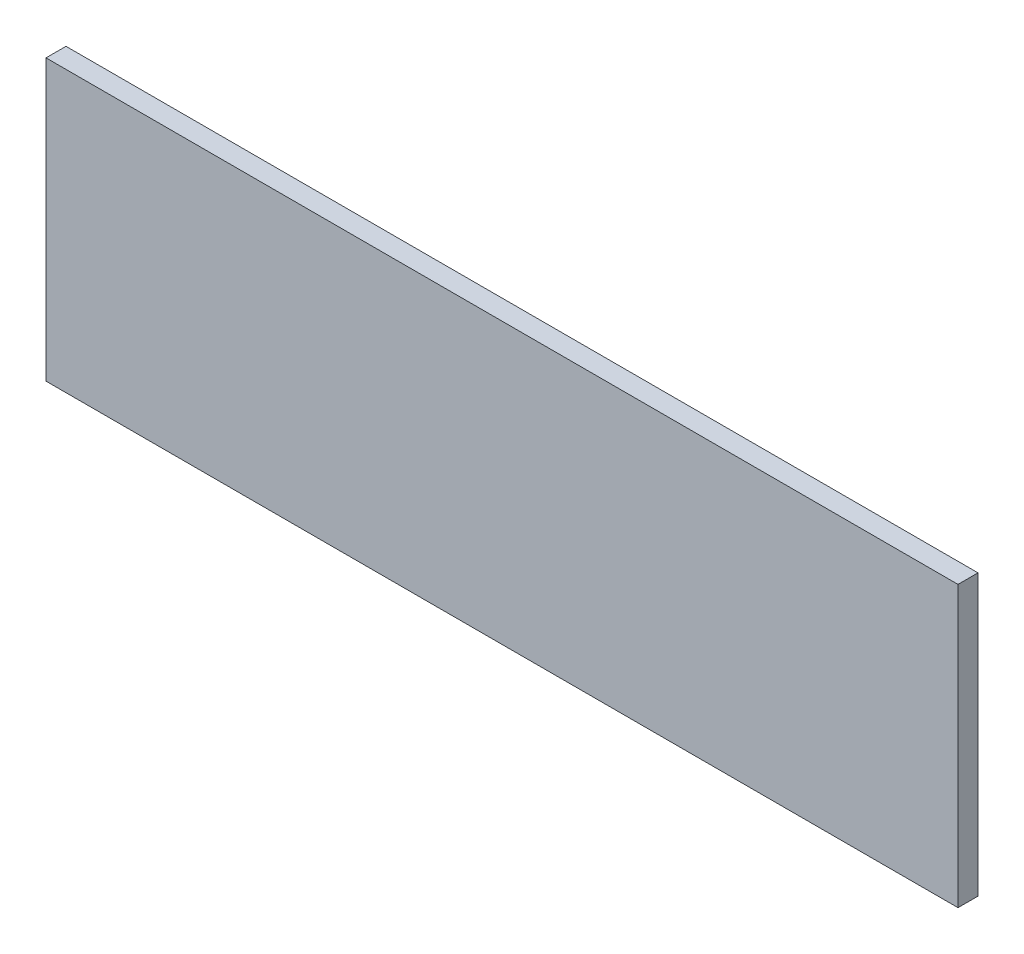
ISO-10303-21;
HEADER;
FILE_DESCRIPTION(('STEP AP214'),'2;1');
FILE_NAME('part.step','',(''),(''),'','','');
FILE_SCHEMA(('AUTOMOTIVE_DESIGN { 1 0 10303 214 1 1 1 1 }'));
ENDSEC;
DATA;
#1=APPLICATION_CONTEXT('core data for automotive mechanical design processes');
#2=APPLICATION_PROTOCOL_DEFINITION('international standard','automotive_design',2000,#1);
#3=PRODUCT_CONTEXT('',#1,'mechanical');
#4=PRODUCT('Part','Part','',(#3));
#5=PRODUCT_RELATED_PRODUCT_CATEGORY('part','',(#4));
#6=PRODUCT_DEFINITION_FORMATION('','',#4);
#7=PRODUCT_DEFINITION_CONTEXT('part definition',#1,'design');
#8=PRODUCT_DEFINITION('design','',#6,#7);
#9=PRODUCT_DEFINITION_SHAPE('','',#8);
#10=(LENGTH_UNIT() NAMED_UNIT(*) SI_UNIT(.MILLI.,.METRE.));
#11=(NAMED_UNIT(*) PLANE_ANGLE_UNIT() SI_UNIT($,.RADIAN.));
#12=(NAMED_UNIT(*) SI_UNIT($,.STERADIAN.) SOLID_ANGLE_UNIT());
#13=UNCERTAINTY_MEASURE_WITH_UNIT(LENGTH_MEASURE(1.E-05),#10,'distance_accuracy_value','');
#14=(GEOMETRIC_REPRESENTATION_CONTEXT(3) GLOBAL_UNCERTAINTY_ASSIGNED_CONTEXT((#13)) GLOBAL_UNIT_ASSIGNED_CONTEXT((#10,
#11,#12)) REPRESENTATION_CONTEXT('',''));
#15=CARTESIAN_POINT('',(0.,0.,0.));
#16=DIRECTION('',(0.,0.,1.));
#17=DIRECTION('',(1.,0.,0.));
#18=AXIS2_PLACEMENT_3D('',#15,#16,#17);
#19=CARTESIAN_POINT('',(-114.,-35.,5.));
#20=DIRECTION('',(1.,0.,0.));
#21=DIRECTION('',(0.,0.,-1.));
#22=AXIS2_PLACEMENT_3D('',#19,#20,#21);
#23=PLANE('',#22);
#24=DIRECTION('',(0.,-1.,0.));
#25=VECTOR('',#24,1.);
#26=CARTESIAN_POINT('',(-114.,-35.,0.));
#27=LINE('',#26,#25);
#28=CARTESIAN_POINT('',(-114.,35.,0.));
#29=VERTEX_POINT('',#28);
#30=CARTESIAN_POINT('',(-114.,-35.,0.));
#31=VERTEX_POINT('',#30);
#32=EDGE_CURVE('E111',#29,#31,#27,.T.);
#33=ORIENTED_EDGE('',*,*,#32,.T.);
#34=DIRECTION('',(0.,0.,-1.));
#35=VECTOR('',#34,1.);
#36=CARTESIAN_POINT('',(-114.,-35.,5.));
#37=LINE('',#36,#35);
#38=CARTESIAN_POINT('',(-114.,-35.,5.));
#39=VERTEX_POINT('',#38);
#40=EDGE_CURVE('E11',#39,#31,#37,.T.);
#41=ORIENTED_EDGE('',*,*,#40,.F.);
#42=DIRECTION('',(0.,-1.,0.));
#43=VECTOR('',#42,1.);
#44=CARTESIAN_POINT('',(-114.,-35.,5.));
#45=LINE('',#44,#43);
#46=CARTESIAN_POINT('',(-114.,35.,5.));
#47=VERTEX_POINT('',#46);
#48=EDGE_CURVE('E95',#47,#39,#45,.T.);
#49=ORIENTED_EDGE('',*,*,#48,.F.);
#50=DIRECTION('',(0.,0.,-1.));
#51=VECTOR('',#50,1.);
#52=CARTESIAN_POINT('',(-114.,35.,5.));
#53=LINE('',#52,#51);
#54=EDGE_CURVE('E107',#47,#29,#53,.T.);
#55=ORIENTED_EDGE('',*,*,#54,.T.);
#56=EDGE_LOOP('',(#33,#41,#49,#55));
#57=FACE_BOUND('',#56,.T.);
#58=ADVANCED_FACE('F43',(#57),#23,.F.);
#59=CARTESIAN_POINT('',(114.,-35.,5.));
#60=DIRECTION('',(0.,1.,0.));
#61=DIRECTION('',(-1.,0.,0.));
#62=AXIS2_PLACEMENT_3D('',#59,#60,#61);
#63=PLANE('',#62);
#64=DIRECTION('',(1.,0.,0.));
#65=VECTOR('',#64,1.);
#66=CARTESIAN_POINT('',(114.,-35.,0.));
#67=LINE('',#66,#65);
#68=CARTESIAN_POINT('',(114.,-35.,0.));
#69=VERTEX_POINT('',#68);
#70=EDGE_CURVE('E100',#31,#69,#67,.T.);
#71=ORIENTED_EDGE('',*,*,#70,.T.);
#72=DIRECTION('',(0.,0.,-1.));
#73=VECTOR('',#72,1.);
#74=CARTESIAN_POINT('',(114.,-35.,5.));
#75=LINE('',#74,#73);
#76=CARTESIAN_POINT('',(114.,-35.,5.));
#77=VERTEX_POINT('',#76);
#78=EDGE_CURVE('E52',#77,#69,#75,.T.);
#79=ORIENTED_EDGE('',*,*,#78,.F.);
#80=DIRECTION('',(1.,0.,0.));
#81=VECTOR('',#80,1.);
#82=CARTESIAN_POINT('',(114.,-35.,5.));
#83=LINE('',#82,#81);
#84=EDGE_CURVE('E90',#39,#77,#83,.T.);
#85=ORIENTED_EDGE('',*,*,#84,.F.);
#86=ORIENTED_EDGE('',*,*,#40,.T.);
#87=EDGE_LOOP('',(#71,#79,#85,#86));
#88=FACE_BOUND('',#87,.T.);
#89=ADVANCED_FACE('F99',(#88),#63,.F.);
#90=CARTESIAN_POINT('',(114.,-35.,5.));
#91=DIRECTION('',(-1.,0.,0.));
#92=DIRECTION('',(0.,0.,1.));
#93=AXIS2_PLACEMENT_3D('',#90,#91,#92);
#94=PLANE('',#93);
#95=DIRECTION('',(0.,1.,0.));
#96=VECTOR('',#95,1.);
#97=CARTESIAN_POINT('',(114.,-35.,0.));
#98=LINE('',#97,#96);
#99=CARTESIAN_POINT('',(114.,35.,0.));
#100=VERTEX_POINT('',#99);
#101=EDGE_CURVE('E77',#69,#100,#98,.T.);
#102=ORIENTED_EDGE('',*,*,#101,.T.);
#103=DIRECTION('',(0.,0.,-1.));
#104=VECTOR('',#103,1.);
#105=CARTESIAN_POINT('',(114.,35.,5.));
#106=LINE('',#105,#104);
#107=CARTESIAN_POINT('',(114.,35.,5.));
#108=VERTEX_POINT('',#107);
#109=EDGE_CURVE('E102',#108,#100,#106,.T.);
#110=ORIENTED_EDGE('',*,*,#109,.F.);
#111=DIRECTION('',(0.,1.,0.));
#112=VECTOR('',#111,1.);
#113=CARTESIAN_POINT('',(114.,-35.,5.));
#114=LINE('',#113,#112);
#115=EDGE_CURVE('E93',#77,#108,#114,.T.);
#116=ORIENTED_EDGE('',*,*,#115,.F.);
#117=ORIENTED_EDGE('',*,*,#78,.T.);
#118=EDGE_LOOP('',(#102,#110,#116,#117));
#119=FACE_BOUND('',#118,.T.);
#120=ADVANCED_FACE('F103',(#119),#94,.F.);
#121=CARTESIAN_POINT('',(114.,35.,5.));
#122=DIRECTION('',(0.,-1.,0.));
#123=DIRECTION('',(1.,0.,0.));
#124=AXIS2_PLACEMENT_3D('',#121,#122,#123);
#125=PLANE('',#124);
#126=DIRECTION('',(-1.,0.,0.));
#127=VECTOR('',#126,1.);
#128=CARTESIAN_POINT('',(114.,35.,0.));
#129=LINE('',#128,#127);
#130=EDGE_CURVE('E83',#100,#29,#129,.T.);
#131=ORIENTED_EDGE('',*,*,#130,.T.);
#132=ORIENTED_EDGE('',*,*,#54,.F.);
#133=DIRECTION('',(-1.,0.,0.));
#134=VECTOR('',#133,1.);
#135=CARTESIAN_POINT('',(114.,35.,5.));
#136=LINE('',#135,#134);
#137=EDGE_CURVE('E60',#108,#47,#136,.T.);
#138=ORIENTED_EDGE('',*,*,#137,.F.);
#139=ORIENTED_EDGE('',*,*,#109,.T.);
#140=EDGE_LOOP('',(#131,#132,#138,#139));
#141=FACE_BOUND('',#140,.T.);
#142=ADVANCED_FACE('F124',(#141),#125,.F.);
#143=CARTESIAN_POINT('',(0.,0.,5.));
#144=DIRECTION('',(0.,0.,1.));
#145=DIRECTION('',(1.,0.,0.));
#146=AXIS2_PLACEMENT_3D('',#143,#144,#145);
#147=PLANE('',#146);
#148=ORIENTED_EDGE('',*,*,#48,.T.);
#149=ORIENTED_EDGE('',*,*,#84,.T.);
#150=ORIENTED_EDGE('',*,*,#115,.T.);
#151=ORIENTED_EDGE('',*,*,#137,.T.);
#152=EDGE_LOOP('',(#148,#149,#150,#151));
#153=FACE_BOUND('',#152,.T.);
#154=ADVANCED_FACE('F91',(#153),#147,.T.);
#155=CARTESIAN_POINT('',(0.,0.,0.));
#156=DIRECTION('',(0.,0.,1.));
#157=DIRECTION('',(1.,0.,0.));
#158=AXIS2_PLACEMENT_3D('',#155,#156,#157);
#159=PLANE('',#158);
#160=ORIENTED_EDGE('',*,*,#32,.F.);
#161=ORIENTED_EDGE('',*,*,#130,.F.);
#162=ORIENTED_EDGE('',*,*,#101,.F.);
#163=ORIENTED_EDGE('',*,*,#70,.F.);
#164=EDGE_LOOP('',(#160,#161,#162,#163));
#165=FACE_BOUND('',#164,.T.);
#166=ADVANCED_FACE('F127',(#165),#159,.F.);
#167=CLOSED_SHELL('',(#58,#89,#120,#142,#154,#166));
#168=MANIFOLD_SOLID_BREP('B2',#167);
#169=ADVANCED_BREP_SHAPE_REPRESENTATION('',(#18,#168),#14);
#170=SHAPE_DEFINITION_REPRESENTATION(#9,#169);
ENDSEC;
END-ISO-10303-21;
